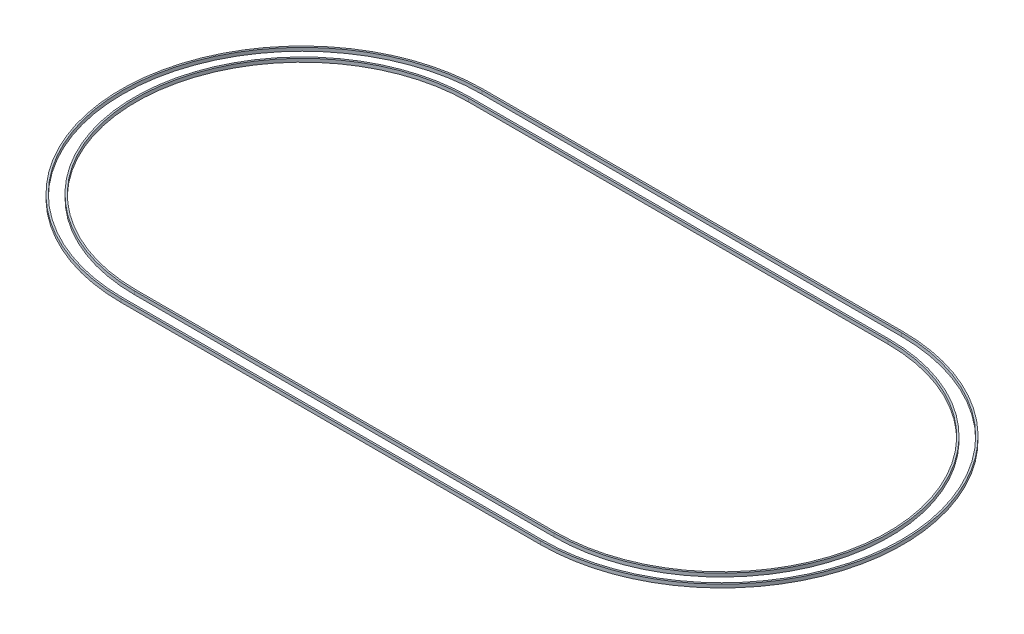
ISO-10303-21;
HEADER;
FILE_DESCRIPTION(('STEP AP214'),'2;1');
FILE_NAME('part.step','',(''),(''),'','','');
FILE_SCHEMA(('AUTOMOTIVE_DESIGN { 1 0 10303 214 1 1 1 1 }'));
ENDSEC;
DATA;
#1=APPLICATION_CONTEXT('core data for automotive mechanical design processes');
#2=APPLICATION_PROTOCOL_DEFINITION('international standard','automotive_design',2000,#1);
#3=PRODUCT_CONTEXT('',#1,'mechanical');
#4=PRODUCT('Part','Part','',(#3));
#5=PRODUCT_RELATED_PRODUCT_CATEGORY('part','',(#4));
#6=PRODUCT_DEFINITION_FORMATION('','',#4);
#7=PRODUCT_DEFINITION_CONTEXT('part definition',#1,'design');
#8=PRODUCT_DEFINITION('design','',#6,#7);
#9=PRODUCT_DEFINITION_SHAPE('','',#8);
#10=(LENGTH_UNIT() NAMED_UNIT(*) SI_UNIT(.MILLI.,.METRE.));
#11=(NAMED_UNIT(*) PLANE_ANGLE_UNIT() SI_UNIT($,.RADIAN.));
#12=(NAMED_UNIT(*) SI_UNIT($,.STERADIAN.) SOLID_ANGLE_UNIT());
#13=UNCERTAINTY_MEASURE_WITH_UNIT(LENGTH_MEASURE(1.E-05),#10,'distance_accuracy_value','');
#14=(GEOMETRIC_REPRESENTATION_CONTEXT(3) GLOBAL_UNCERTAINTY_ASSIGNED_CONTEXT((#13)) GLOBAL_UNIT_ASSIGNED_CONTEXT((#10,
#11,#12)) REPRESENTATION_CONTEXT('',''));
#15=CARTESIAN_POINT('',(0.,0.,0.));
#16=DIRECTION('',(0.,0.,1.));
#17=DIRECTION('',(1.,0.,0.));
#18=AXIS2_PLACEMENT_3D('',#15,#16,#17);
#19=CARTESIAN_POINT('',(-25000.,400.,-21600.));
#20=DIRECTION('',(0.,0.,-1.));
#21=DIRECTION('',(-1.,0.,0.));
#22=AXIS2_PLACEMENT_3D('',#19,#20,#21);
#23=PLANE('',#22);
#24=DIRECTION('',(1.,0.,0.));
#25=VECTOR('',#24,1.);
#26=CARTESIAN_POINT('',(-25000.,0.,-21600.));
#27=LINE('',#26,#25);
#28=CARTESIAN_POINT('',(-25000.,0.,-21600.));
#29=VERTEX_POINT('',#28);
#30=CARTESIAN_POINT('',(25000.,0.,-21600.));
#31=VERTEX_POINT('',#30);
#32=EDGE_CURVE('E162',#29,#31,#27,.T.);
#33=ORIENTED_EDGE('',*,*,#32,.F.);
#34=DIRECTION('',(0.,-1.,0.));
#35=VECTOR('',#34,1.);
#36=CARTESIAN_POINT('',(-25000.,400.,-21600.));
#37=LINE('',#36,#35);
#38=CARTESIAN_POINT('',(-25000.,400.,-21600.));
#39=VERTEX_POINT('',#38);
#40=EDGE_CURVE('E13',#39,#29,#37,.T.);
#41=ORIENTED_EDGE('',*,*,#40,.F.);
#42=DIRECTION('',(1.,0.,0.));
#43=VECTOR('',#42,1.);
#44=CARTESIAN_POINT('',(-25000.,400.,-21600.));
#45=LINE('',#44,#43);
#46=CARTESIAN_POINT('',(25000.,400.,-21600.));
#47=VERTEX_POINT('',#46);
#48=EDGE_CURVE('E166',#39,#47,#45,.T.);
#49=ORIENTED_EDGE('',*,*,#48,.T.);
#50=DIRECTION('',(0.,-1.,0.));
#51=VECTOR('',#50,1.);
#52=CARTESIAN_POINT('',(25000.,400.,-21600.));
#53=LINE('',#52,#51);
#54=EDGE_CURVE('E69',#47,#31,#53,.T.);
#55=ORIENTED_EDGE('',*,*,#54,.T.);
#56=EDGE_LOOP('',(#33,#41,#49,#55));
#57=FACE_BOUND('',#56,.T.);
#58=ADVANCED_FACE('F66',(#57),#23,.T.);
#59=CARTESIAN_POINT('',(-25000.,400.,9.18485099360515E-12));
#60=DIRECTION('',(0.,-1.,0.));
#61=DIRECTION('',(0.,0.,-1.));
#62=AXIS2_PLACEMENT_3D('',#59,#60,#61);
#63=CYLINDRICAL_SURFACE('',#62,21600.);
#64=CARTESIAN_POINT('',(-25000.,0.,9.18485099360515E-12));
#65=DIRECTION('',(0.,1.,0.));
#66=DIRECTION('',(0.,0.,1.));
#67=AXIS2_PLACEMENT_3D('',#64,#65,#66);
#68=CIRCLE('',#67,21600.);
#69=CARTESIAN_POINT('',(-25000.,0.,21600.));
#70=VERTEX_POINT('',#69);
#71=EDGE_CURVE('E170',#29,#70,#68,.T.);
#72=ORIENTED_EDGE('',*,*,#71,.T.);
#73=DIRECTION('',(0.,-1.,0.));
#74=VECTOR('',#73,1.);
#75=CARTESIAN_POINT('',(-25000.,400.,21600.));
#76=LINE('',#75,#74);
#77=CARTESIAN_POINT('',(-25000.,400.,21600.));
#78=VERTEX_POINT('',#77);
#79=EDGE_CURVE('E74',#78,#70,#76,.T.);
#80=ORIENTED_EDGE('',*,*,#79,.F.);
#81=CARTESIAN_POINT('',(-25000.,400.,9.18485099360515E-12));
#82=DIRECTION('',(0.,1.,0.));
#83=DIRECTION('',(0.,0.,1.));
#84=AXIS2_PLACEMENT_3D('',#81,#82,#83);
#85=CIRCLE('',#84,21600.);
#86=EDGE_CURVE('E175',#39,#78,#85,.T.);
#87=ORIENTED_EDGE('',*,*,#86,.F.);
#88=ORIENTED_EDGE('',*,*,#40,.T.);
#89=EDGE_LOOP('',(#72,#80,#87,#88));
#90=FACE_BOUND('',#89,.T.);
#91=ADVANCED_FACE('F202',(#90),#63,.T.);
#92=CARTESIAN_POINT('',(-25000.,400.,21600.));
#93=DIRECTION('',(0.,0.,-1.));
#94=DIRECTION('',(-1.,0.,0.));
#95=AXIS2_PLACEMENT_3D('',#92,#93,#94);
#96=PLANE('',#95);
#97=DIRECTION('',(1.,0.,0.));
#98=VECTOR('',#97,1.);
#99=CARTESIAN_POINT('',(-25000.,0.,21600.));
#100=LINE('',#99,#98);
#101=CARTESIAN_POINT('',(25000.,0.,21600.));
#102=VERTEX_POINT('',#101);
#103=EDGE_CURVE('E182',#70,#102,#100,.T.);
#104=ORIENTED_EDGE('',*,*,#103,.T.);
#105=DIRECTION('',(0.,-1.,0.));
#106=VECTOR('',#105,1.);
#107=CARTESIAN_POINT('',(25000.,400.,21600.));
#108=LINE('',#107,#106);
#109=CARTESIAN_POINT('',(25000.,400.,21600.));
#110=VERTEX_POINT('',#109);
#111=EDGE_CURVE('E187',#110,#102,#108,.T.);
#112=ORIENTED_EDGE('',*,*,#111,.F.);
#113=DIRECTION('',(1.,0.,0.));
#114=VECTOR('',#113,1.);
#115=CARTESIAN_POINT('',(-25000.,400.,21600.));
#116=LINE('',#115,#114);
#117=EDGE_CURVE('E173',#78,#110,#116,.T.);
#118=ORIENTED_EDGE('',*,*,#117,.F.);
#119=ORIENTED_EDGE('',*,*,#79,.T.);
#120=EDGE_LOOP('',(#104,#112,#118,#119));
#121=FACE_BOUND('',#120,.T.);
#122=ADVANCED_FACE('F206',(#121),#96,.F.);
#123=CARTESIAN_POINT('',(25000.,400.,0.));
#124=DIRECTION('',(0.,-1.,0.));
#125=DIRECTION('',(0.,0.,-1.));
#126=AXIS2_PLACEMENT_3D('',#123,#124,#125);
#127=CYLINDRICAL_SURFACE('',#126,21600.);
#128=CARTESIAN_POINT('',(25000.,0.,0.));
#129=DIRECTION('',(0.,-1.,0.));
#130=DIRECTION('',(0.,0.,-1.));
#131=AXIS2_PLACEMENT_3D('',#128,#129,#130);
#132=CIRCLE('',#131,21600.);
#133=EDGE_CURVE('E179',#31,#102,#132,.T.);
#134=ORIENTED_EDGE('',*,*,#133,.F.);
#135=ORIENTED_EDGE('',*,*,#54,.F.);
#136=CARTESIAN_POINT('',(25000.,400.,0.));
#137=DIRECTION('',(0.,-1.,0.));
#138=DIRECTION('',(0.,0.,-1.));
#139=AXIS2_PLACEMENT_3D('',#136,#137,#138);
#140=CIRCLE('',#139,21600.);
#141=EDGE_CURVE('E169',#47,#110,#140,.T.);
#142=ORIENTED_EDGE('',*,*,#141,.T.);
#143=ORIENTED_EDGE('',*,*,#111,.T.);
#144=EDGE_LOOP('',(#134,#135,#142,#143));
#145=FACE_BOUND('',#144,.T.);
#146=ADVANCED_FACE('F195',(#145),#127,.T.);
#147=CARTESIAN_POINT('',(25000.,400.,0.));
#148=DIRECTION('',(0.,-1.,0.));
#149=DIRECTION('',(0.,0.,-1.));
#150=AXIS2_PLACEMENT_3D('',#147,#148,#149);
#151=PLANE('',#150);
#152=CARTESIAN_POINT('',(-25000.,400.,9.84811851154435E-12));
#153=DIRECTION('',(0.,1.,0.));
#154=DIRECTION('',(0.,0.,1.));
#155=AXIS2_PLACEMENT_3D('',#152,#153,#154);
#156=CIRCLE('',#155,21400.);
#157=CARTESIAN_POINT('',(-25000.,400.,-21400.));
#158=VERTEX_POINT('',#157);
#159=CARTESIAN_POINT('',(-25000.,400.,21400.));
#160=VERTEX_POINT('',#159);
#161=EDGE_CURVE('E136',#158,#160,#156,.T.);
#162=ORIENTED_EDGE('',*,*,#161,.F.);
#163=DIRECTION('',(1.,0.,0.));
#164=VECTOR('',#163,1.);
#165=CARTESIAN_POINT('',(-25000.,400.,-21400.));
#166=LINE('',#165,#164);
#167=CARTESIAN_POINT('',(25000.,400.,-21400.));
#168=VERTEX_POINT('',#167);
#169=EDGE_CURVE('E133',#158,#168,#166,.T.);
#170=ORIENTED_EDGE('',*,*,#169,.T.);
#171=CARTESIAN_POINT('',(25000.,400.,6.63267517939197E-13));
#172=DIRECTION('',(0.,-1.,0.));
#173=DIRECTION('',(0.,0.,-1.));
#174=AXIS2_PLACEMENT_3D('',#171,#172,#173);
#175=CIRCLE('',#174,21400.);
#176=CARTESIAN_POINT('',(25000.,400.,21400.));
#177=VERTEX_POINT('',#176);
#178=EDGE_CURVE('E139',#168,#177,#175,.T.);
#179=ORIENTED_EDGE('',*,*,#178,.T.);
#180=DIRECTION('',(1.,0.,0.));
#181=VECTOR('',#180,1.);
#182=CARTESIAN_POINT('',(-25000.,400.,21400.));
#183=LINE('',#182,#181);
#184=EDGE_CURVE('E143',#160,#177,#183,.T.);
#185=ORIENTED_EDGE('',*,*,#184,.F.);
#186=EDGE_LOOP('',(#162,#170,#179,#185));
#187=FACE_BOUND('',#186,.T.);
#188=ORIENTED_EDGE('',*,*,#48,.F.);
#189=ORIENTED_EDGE('',*,*,#86,.T.);
#190=ORIENTED_EDGE('',*,*,#117,.T.);
#191=ORIENTED_EDGE('',*,*,#141,.F.);
#192=EDGE_LOOP('',(#188,#189,#190,#191));
#193=FACE_BOUND('',#192,.T.);
#194=ADVANCED_FACE('F145',(#187,#193),#151,.F.);
#195=CARTESIAN_POINT('',(25000.,0.,0.));
#196=DIRECTION('',(0.,-1.,0.));
#197=DIRECTION('',(0.,0.,-1.));
#198=AXIS2_PLACEMENT_3D('',#195,#196,#197);
#199=PLANE('',#198);
#200=DIRECTION('',(1.,0.,0.));
#201=VECTOR('',#200,1.);
#202=CARTESIAN_POINT('',(-25000.,0.,-21400.));
#203=LINE('',#202,#201);
#204=CARTESIAN_POINT('',(-25000.,0.,-21400.));
#205=VERTEX_POINT('',#204);
#206=CARTESIAN_POINT('',(25000.,0.,-21400.));
#207=VERTEX_POINT('',#206);
#208=EDGE_CURVE('E90',#205,#207,#203,.T.);
#209=ORIENTED_EDGE('',*,*,#208,.F.);
#210=CARTESIAN_POINT('',(-25000.,0.,9.84811851154435E-12));
#211=DIRECTION('',(0.,1.,0.));
#212=DIRECTION('',(0.,0.,1.));
#213=AXIS2_PLACEMENT_3D('',#210,#211,#212);
#214=CIRCLE('',#213,21400.);
#215=CARTESIAN_POINT('',(-25000.,0.,21400.));
#216=VERTEX_POINT('',#215);
#217=EDGE_CURVE('E147',#205,#216,#214,.T.);
#218=ORIENTED_EDGE('',*,*,#217,.T.);
#219=DIRECTION('',(1.,0.,0.));
#220=VECTOR('',#219,1.);
#221=CARTESIAN_POINT('',(-25000.,0.,21400.));
#222=LINE('',#221,#220);
#223=CARTESIAN_POINT('',(25000.,0.,21400.));
#224=VERTEX_POINT('',#223);
#225=EDGE_CURVE('E150',#216,#224,#222,.T.);
#226=ORIENTED_EDGE('',*,*,#225,.T.);
#227=CARTESIAN_POINT('',(25000.,0.,6.63267517939197E-13));
#228=DIRECTION('',(0.,-1.,0.));
#229=DIRECTION('',(0.,0.,-1.));
#230=AXIS2_PLACEMENT_3D('',#227,#228,#229);
#231=CIRCLE('',#230,21400.);
#232=EDGE_CURVE('E156',#207,#224,#231,.T.);
#233=ORIENTED_EDGE('',*,*,#232,.F.);
#234=EDGE_LOOP('',(#209,#218,#226,#233));
#235=FACE_BOUND('',#234,.T.);
#236=ORIENTED_EDGE('',*,*,#32,.T.);
#237=ORIENTED_EDGE('',*,*,#133,.T.);
#238=ORIENTED_EDGE('',*,*,#103,.F.);
#239=ORIENTED_EDGE('',*,*,#71,.F.);
#240=EDGE_LOOP('',(#236,#237,#238,#239));
#241=FACE_BOUND('',#240,.T.);
#242=ADVANCED_FACE('F199',(#235,#241),#199,.T.);
#243=CARTESIAN_POINT('',(-25000.,400.,-21400.));
#244=DIRECTION('',(0.,0.,-1.));
#245=DIRECTION('',(-1.,0.,0.));
#246=AXIS2_PLACEMENT_3D('',#243,#244,#245);
#247=PLANE('',#246);
#248=ORIENTED_EDGE('',*,*,#208,.T.);
#249=DIRECTION('',(0.,-1.,0.));
#250=VECTOR('',#249,1.);
#251=CARTESIAN_POINT('',(25000.,400.,-21400.));
#252=LINE('',#251,#250);
#253=EDGE_CURVE('E130',#168,#207,#252,.T.);
#254=ORIENTED_EDGE('',*,*,#253,.F.);
#255=ORIENTED_EDGE('',*,*,#169,.F.);
#256=DIRECTION('',(0.,-1.,0.));
#257=VECTOR('',#256,1.);
#258=CARTESIAN_POINT('',(-25000.,400.,-21400.));
#259=LINE('',#258,#257);
#260=EDGE_CURVE('E160',#158,#205,#259,.T.);
#261=ORIENTED_EDGE('',*,*,#260,.T.);
#262=EDGE_LOOP('',(#248,#254,#255,#261));
#263=FACE_BOUND('',#262,.T.);
#264=ADVANCED_FACE('F131',(#263),#247,.F.);
#265=CARTESIAN_POINT('',(-25000.,400.,9.84811851154435E-12));
#266=DIRECTION('',(0.,-1.,0.));
#267=DIRECTION('',(0.,0.,-1.));
#268=AXIS2_PLACEMENT_3D('',#265,#266,#267);
#269=CYLINDRICAL_SURFACE('',#268,21400.);
#270=ORIENTED_EDGE('',*,*,#217,.F.);
#271=ORIENTED_EDGE('',*,*,#260,.F.);
#272=ORIENTED_EDGE('',*,*,#161,.T.);
#273=DIRECTION('',(0.,-1.,0.));
#274=VECTOR('',#273,1.);
#275=CARTESIAN_POINT('',(-25000.,400.,21400.));
#276=LINE('',#275,#274);
#277=EDGE_CURVE('E163',#160,#216,#276,.T.);
#278=ORIENTED_EDGE('',*,*,#277,.T.);
#279=EDGE_LOOP('',(#270,#271,#272,#278));
#280=FACE_BOUND('',#279,.T.);
#281=ADVANCED_FACE('F250',(#280),#269,.F.);
#282=CARTESIAN_POINT('',(-25000.,400.,21400.));
#283=DIRECTION('',(0.,0.,-1.));
#284=DIRECTION('',(-1.,0.,0.));
#285=AXIS2_PLACEMENT_3D('',#282,#283,#284);
#286=PLANE('',#285);
#287=ORIENTED_EDGE('',*,*,#225,.F.);
#288=ORIENTED_EDGE('',*,*,#277,.F.);
#289=ORIENTED_EDGE('',*,*,#184,.T.);
#290=DIRECTION('',(0.,-1.,0.));
#291=VECTOR('',#290,1.);
#292=CARTESIAN_POINT('',(25000.,400.,21400.));
#293=LINE('',#292,#291);
#294=EDGE_CURVE('E82',#177,#224,#293,.T.);
#295=ORIENTED_EDGE('',*,*,#294,.T.);
#296=EDGE_LOOP('',(#287,#288,#289,#295));
#297=FACE_BOUND('',#296,.T.);
#298=ADVANCED_FACE('F258',(#297),#286,.T.);
#299=CARTESIAN_POINT('',(25000.,400.,6.63267517939197E-13));
#300=DIRECTION('',(0.,-1.,0.));
#301=DIRECTION('',(0.,0.,-1.));
#302=AXIS2_PLACEMENT_3D('',#299,#300,#301);
#303=CYLINDRICAL_SURFACE('',#302,21400.);
#304=ORIENTED_EDGE('',*,*,#232,.T.);
#305=ORIENTED_EDGE('',*,*,#294,.F.);
#306=ORIENTED_EDGE('',*,*,#178,.F.);
#307=ORIENTED_EDGE('',*,*,#253,.T.);
#308=EDGE_LOOP('',(#304,#305,#306,#307));
#309=FACE_BOUND('',#308,.T.);
#310=ADVANCED_FACE('F140',(#309),#303,.F.);
#311=CLOSED_SHELL('',(#58,#91,#122,#146,#194,#242,#264,#281,#298,#310));
#312=MANIFOLD_SOLID_BREP('B2',#311);
#313=CARTESIAN_POINT('',(25000.,400.,6.63267517939197E-13));
#314=DIRECTION('',(0.,-1.,0.));
#315=DIRECTION('',(0.,0.,-1.));
#316=AXIS2_PLACEMENT_3D('',#313,#314,#315);
#317=CYLINDRICAL_SURFACE('',#316,20000.);
#318=CARTESIAN_POINT('',(25000.,0.,6.63267517939197E-13));
#319=DIRECTION('',(0.,1.,0.));
#320=DIRECTION('',(0.,0.,1.));
#321=AXIS2_PLACEMENT_3D('',#318,#319,#320);
#322=CIRCLE('',#321,20000.);
#323=CARTESIAN_POINT('',(25000.,0.,-20000.));
#324=VERTEX_POINT('',#323);
#325=CARTESIAN_POINT('',(25000.,0.,20000.));
#326=VERTEX_POINT('',#325);
#327=EDGE_CURVE('E406',#324,#326,#322,.F.);
#328=ORIENTED_EDGE('',*,*,#327,.F.);
#329=DIRECTION('',(0.,-1.,0.));
#330=VECTOR('',#329,1.);
#331=CARTESIAN_POINT('',(25000.,400.,-20000.));
#332=LINE('',#331,#330);
#333=CARTESIAN_POINT('',(25000.,400.,-20000.));
#334=VERTEX_POINT('',#333);
#335=EDGE_CURVE('E64',#334,#324,#332,.T.);
#336=ORIENTED_EDGE('',*,*,#335,.F.);
#337=CARTESIAN_POINT('',(25000.,400.,6.63267517939197E-13));
#338=DIRECTION('',(0.,1.,0.));
#339=DIRECTION('',(0.,0.,1.));
#340=AXIS2_PLACEMENT_3D('',#337,#338,#339);
#341=CIRCLE('',#340,20000.);
#342=CARTESIAN_POINT('',(25000.,400.,20000.));
#343=VERTEX_POINT('',#342);
#344=EDGE_CURVE('E387',#334,#343,#341,.F.);
#345=ORIENTED_EDGE('',*,*,#344,.T.);
#346=DIRECTION('',(0.,-1.,0.));
#347=VECTOR('',#346,1.);
#348=CARTESIAN_POINT('',(25000.,400.,20000.));
#349=LINE('',#348,#347);
#350=EDGE_CURVE('E349',#343,#326,#349,.T.);
#351=ORIENTED_EDGE('',*,*,#350,.T.);
#352=EDGE_LOOP('',(#328,#336,#345,#351));
#353=FACE_BOUND('',#352,.T.);
#354=ADVANCED_FACE('F295',(#353),#317,.T.);
#355=CARTESIAN_POINT('',(0.,400.,-20000.));
#356=DIRECTION('',(0.,0.,-1.));
#357=DIRECTION('',(-1.,0.,0.));
#358=AXIS2_PLACEMENT_3D('',#355,#356,#357);
#359=PLANE('',#358);
#360=DIRECTION('',(1.,0.,0.));
#361=VECTOR('',#360,1.);
#362=CARTESIAN_POINT('',(0.,0.,-20000.));
#363=LINE('',#362,#361);
#364=CARTESIAN_POINT('',(-25000.,0.,-20000.));
#365=VERTEX_POINT('',#364);
#366=EDGE_CURVE('E377',#365,#324,#363,.T.);
#367=ORIENTED_EDGE('',*,*,#366,.F.);
#368=DIRECTION('',(0.,-1.,0.));
#369=VECTOR('',#368,1.);
#370=CARTESIAN_POINT('',(-25000.,400.,-20000.));
#371=LINE('',#370,#369);
#372=CARTESIAN_POINT('',(-25000.,400.,-20000.));
#373=VERTEX_POINT('',#372);
#374=EDGE_CURVE('E305',#373,#365,#371,.T.);
#375=ORIENTED_EDGE('',*,*,#374,.F.);
#376=DIRECTION('',(1.,0.,0.));
#377=VECTOR('',#376,1.);
#378=CARTESIAN_POINT('',(0.,400.,-20000.));
#379=LINE('',#378,#377);
#380=EDGE_CURVE('E375',#373,#334,#379,.T.);
#381=ORIENTED_EDGE('',*,*,#380,.T.);
#382=ORIENTED_EDGE('',*,*,#335,.T.);
#383=EDGE_LOOP('',(#367,#375,#381,#382));
#384=FACE_BOUND('',#383,.T.);
#385=ADVANCED_FACE('F373',(#384),#359,.T.);
#386=CARTESIAN_POINT('',(-25000.,400.,9.84811851154435E-12));
#387=DIRECTION('',(0.,-1.,0.));
#388=DIRECTION('',(0.,0.,-1.));
#389=AXIS2_PLACEMENT_3D('',#386,#387,#388);
#390=CYLINDRICAL_SURFACE('',#389,20000.);
#391=CARTESIAN_POINT('',(-25000.,0.,9.84811851154435E-12));
#392=DIRECTION('',(0.,1.,0.));
#393=DIRECTION('',(0.,0.,1.));
#394=AXIS2_PLACEMENT_3D('',#391,#392,#393);
#395=CIRCLE('',#394,20000.);
#396=CARTESIAN_POINT('',(-25000.,0.,20000.));
#397=VERTEX_POINT('',#396);
#398=EDGE_CURVE('E409',#365,#397,#395,.T.);
#399=ORIENTED_EDGE('',*,*,#398,.T.);
#400=DIRECTION('',(0.,-1.,0.));
#401=VECTOR('',#400,1.);
#402=CARTESIAN_POINT('',(-25000.,400.,20000.));
#403=LINE('',#402,#401);
#404=CARTESIAN_POINT('',(-25000.,400.,20000.));
#405=VERTEX_POINT('',#404);
#406=EDGE_CURVE('E380',#405,#397,#403,.T.);
#407=ORIENTED_EDGE('',*,*,#406,.F.);
#408=CARTESIAN_POINT('',(-25000.,400.,9.84811851154435E-12));
#409=DIRECTION('',(0.,1.,0.));
#410=DIRECTION('',(0.,0.,1.));
#411=AXIS2_PLACEMENT_3D('',#408,#409,#410);
#412=CIRCLE('',#411,20000.);
#413=EDGE_CURVE('E383',#373,#405,#412,.T.);
#414=ORIENTED_EDGE('',*,*,#413,.F.);
#415=ORIENTED_EDGE('',*,*,#374,.T.);
#416=EDGE_LOOP('',(#399,#407,#414,#415));
#417=FACE_BOUND('',#416,.T.);
#418=ADVANCED_FACE('F384',(#417),#390,.T.);
#419=CARTESIAN_POINT('',(-25000.,400.,9.84811851154435E-12));
#420=DIRECTION('',(0.,-1.,0.));
#421=DIRECTION('',(0.,0.,-1.));
#422=AXIS2_PLACEMENT_3D('',#419,#420,#421);
#423=CYLINDRICAL_SURFACE('',#422,19800.);
#424=CARTESIAN_POINT('',(-25000.,0.,9.84811851154435E-12));
#425=DIRECTION('',(0.,1.,0.));
#426=DIRECTION('',(0.,0.,1.));
#427=AXIS2_PLACEMENT_3D('',#424,#425,#426);
#428=CIRCLE('',#427,19800.);
#429=CARTESIAN_POINT('',(-25000.,0.,-19800.));
#430=VERTEX_POINT('',#429);
#431=CARTESIAN_POINT('',(-25000.,0.,19800.));
#432=VERTEX_POINT('',#431);
#433=EDGE_CURVE('E395',#430,#432,#428,.T.);
#434=ORIENTED_EDGE('',*,*,#433,.F.);
#435=DIRECTION('',(0.,-1.,0.));
#436=VECTOR('',#435,1.);
#437=CARTESIAN_POINT('',(-25000.,400.,-19800.));
#438=LINE('',#437,#436);
#439=CARTESIAN_POINT('',(-25000.,400.,-19800.));
#440=VERTEX_POINT('',#439);
#441=EDGE_CURVE('E299',#440,#430,#438,.T.);
#442=ORIENTED_EDGE('',*,*,#441,.F.);
#443=CARTESIAN_POINT('',(-25000.,400.,9.84811851154435E-12));
#444=DIRECTION('',(0.,1.,0.));
#445=DIRECTION('',(0.,0.,1.));
#446=AXIS2_PLACEMENT_3D('',#443,#444,#445);
#447=CIRCLE('',#446,19800.);
#448=CARTESIAN_POINT('',(-25000.,400.,19800.));
#449=VERTEX_POINT('',#448);
#450=EDGE_CURVE('E412',#440,#449,#447,.T.);
#451=ORIENTED_EDGE('',*,*,#450,.T.);
#452=DIRECTION('',(0.,-1.,0.));
#453=VECTOR('',#452,1.);
#454=CARTESIAN_POINT('',(-25000.,400.,19800.));
#455=LINE('',#454,#453);
#456=EDGE_CURVE('E394',#449,#432,#455,.T.);
#457=ORIENTED_EDGE('',*,*,#456,.T.);
#458=EDGE_LOOP('',(#434,#442,#451,#457));
#459=FACE_BOUND('',#458,.T.);
#460=ADVANCED_FACE('F297',(#459),#423,.F.);
#461=CARTESIAN_POINT('',(0.,400.,-19800.));
#462=DIRECTION('',(0.,0.,-1.));
#463=DIRECTION('',(-1.,0.,0.));
#464=AXIS2_PLACEMENT_3D('',#461,#462,#463);
#465=PLANE('',#464);
#466=DIRECTION('',(1.,0.,0.));
#467=VECTOR('',#466,1.);
#468=CARTESIAN_POINT('',(0.,0.,-19800.));
#469=LINE('',#468,#467);
#470=CARTESIAN_POINT('',(25000.,0.,-19800.));
#471=VERTEX_POINT('',#470);
#472=EDGE_CURVE('E398',#430,#471,#469,.T.);
#473=ORIENTED_EDGE('',*,*,#472,.T.);
#474=DIRECTION('',(0.,-1.,0.));
#475=VECTOR('',#474,1.);
#476=CARTESIAN_POINT('',(25000.,400.,-19800.));
#477=LINE('',#476,#475);
#478=CARTESIAN_POINT('',(25000.,400.,-19800.));
#479=VERTEX_POINT('',#478);
#480=EDGE_CURVE('E417',#479,#471,#477,.T.);
#481=ORIENTED_EDGE('',*,*,#480,.F.);
#482=DIRECTION('',(1.,0.,0.));
#483=VECTOR('',#482,1.);
#484=CARTESIAN_POINT('',(0.,400.,-19800.));
#485=LINE('',#484,#483);
#486=EDGE_CURVE('E426',#440,#479,#485,.T.);
#487=ORIENTED_EDGE('',*,*,#486,.F.);
#488=ORIENTED_EDGE('',*,*,#441,.T.);
#489=EDGE_LOOP('',(#473,#481,#487,#488));
#490=FACE_BOUND('',#489,.T.);
#491=ADVANCED_FACE('F425',(#490),#465,.F.);
#492=CARTESIAN_POINT('',(25000.,400.,6.63267517939197E-13));
#493=DIRECTION('',(0.,-1.,0.));
#494=DIRECTION('',(0.,0.,-1.));
#495=AXIS2_PLACEMENT_3D('',#492,#493,#494);
#496=CYLINDRICAL_SURFACE('',#495,19800.);
#497=CARTESIAN_POINT('',(25000.,0.,6.63267517939197E-13));
#498=DIRECTION('',(0.,1.,0.));
#499=DIRECTION('',(0.,0.,1.));
#500=AXIS2_PLACEMENT_3D('',#497,#498,#499);
#501=CIRCLE('',#500,19800.);
#502=CARTESIAN_POINT('',(25000.,0.,19800.));
#503=VERTEX_POINT('',#502);
#504=EDGE_CURVE('E400',#471,#503,#501,.F.);
#505=ORIENTED_EDGE('',*,*,#504,.T.);
#506=DIRECTION('',(0.,-1.,0.));
#507=VECTOR('',#506,1.);
#508=CARTESIAN_POINT('',(25000.,400.,19800.));
#509=LINE('',#508,#507);
#510=CARTESIAN_POINT('',(25000.,400.,19800.));
#511=VERTEX_POINT('',#510);
#512=EDGE_CURVE('E416',#511,#503,#509,.T.);
#513=ORIENTED_EDGE('',*,*,#512,.F.);
#514=CARTESIAN_POINT('',(25000.,400.,6.63267517939197E-13));
#515=DIRECTION('',(0.,1.,0.));
#516=DIRECTION('',(0.,0.,1.));
#517=AXIS2_PLACEMENT_3D('',#514,#515,#516);
#518=CIRCLE('',#517,19800.);
#519=EDGE_CURVE('E464',#479,#511,#518,.F.);
#520=ORIENTED_EDGE('',*,*,#519,.F.);
#521=ORIENTED_EDGE('',*,*,#480,.T.);
#522=EDGE_LOOP('',(#505,#513,#520,#521));
#523=FACE_BOUND('',#522,.T.);
#524=ADVANCED_FACE('F436',(#523),#496,.F.);
#525=CARTESIAN_POINT('',(0.,400.,19800.));
#526=DIRECTION('',(0.,0.,-1.));
#527=DIRECTION('',(-1.,0.,0.));
#528=AXIS2_PLACEMENT_3D('',#525,#526,#527);
#529=PLANE('',#528);
#530=DIRECTION('',(1.,0.,0.));
#531=VECTOR('',#530,1.);
#532=CARTESIAN_POINT('',(0.,0.,19800.));
#533=LINE('',#532,#531);
#534=EDGE_CURVE('E403',#432,#503,#533,.T.);
#535=ORIENTED_EDGE('',*,*,#534,.F.);
#536=ORIENTED_EDGE('',*,*,#456,.F.);
#537=DIRECTION('',(1.,0.,0.));
#538=VECTOR('',#537,1.);
#539=CARTESIAN_POINT('',(0.,400.,19800.));
#540=LINE('',#539,#538);
#541=EDGE_CURVE('E389',#449,#511,#540,.T.);
#542=ORIENTED_EDGE('',*,*,#541,.T.);
#543=ORIENTED_EDGE('',*,*,#512,.T.);
#544=EDGE_LOOP('',(#535,#536,#542,#543));
#545=FACE_BOUND('',#544,.T.);
#546=ADVANCED_FACE('F434',(#545),#529,.T.);
#547=CARTESIAN_POINT('',(0.,400.,20000.));
#548=DIRECTION('',(0.,0.,-1.));
#549=DIRECTION('',(-1.,0.,0.));
#550=AXIS2_PLACEMENT_3D('',#547,#548,#549);
#551=PLANE('',#550);
#552=DIRECTION('',(1.,0.,0.));
#553=VECTOR('',#552,1.);
#554=CARTESIAN_POINT('',(0.,0.,20000.));
#555=LINE('',#554,#553);
#556=EDGE_CURVE('E342',#397,#326,#555,.T.);
#557=ORIENTED_EDGE('',*,*,#556,.T.);
#558=ORIENTED_EDGE('',*,*,#350,.F.);
#559=DIRECTION('',(1.,0.,0.));
#560=VECTOR('',#559,1.);
#561=CARTESIAN_POINT('',(0.,400.,20000.));
#562=LINE('',#561,#560);
#563=EDGE_CURVE('E314',#405,#343,#562,.T.);
#564=ORIENTED_EDGE('',*,*,#563,.F.);
#565=ORIENTED_EDGE('',*,*,#406,.T.);
#566=EDGE_LOOP('',(#557,#558,#564,#565));
#567=FACE_BOUND('',#566,.T.);
#568=ADVANCED_FACE('F443',(#567),#551,.F.);
#569=CARTESIAN_POINT('',(0.,400.,0.));
#570=DIRECTION('',(0.,1.,0.));
#571=DIRECTION('',(0.,0.,1.));
#572=AXIS2_PLACEMENT_3D('',#569,#570,#571);
#573=PLANE('',#572);
#574=ORIENTED_EDGE('',*,*,#450,.F.);
#575=ORIENTED_EDGE('',*,*,#486,.T.);
#576=ORIENTED_EDGE('',*,*,#519,.T.);
#577=ORIENTED_EDGE('',*,*,#541,.F.);
#578=EDGE_LOOP('',(#574,#575,#576,#577));
#579=FACE_BOUND('',#578,.T.);
#580=ORIENTED_EDGE('',*,*,#344,.F.);
#581=ORIENTED_EDGE('',*,*,#380,.F.);
#582=ORIENTED_EDGE('',*,*,#413,.T.);
#583=ORIENTED_EDGE('',*,*,#563,.T.);
#584=EDGE_LOOP('',(#580,#581,#582,#583));
#585=FACE_BOUND('',#584,.T.);
#586=ADVANCED_FACE('F386',(#579,#585),#573,.T.);
#587=CARTESIAN_POINT('',(0.,0.,0.));
#588=DIRECTION('',(0.,1.,0.));
#589=DIRECTION('',(0.,0.,1.));
#590=AXIS2_PLACEMENT_3D('',#587,#588,#589);
#591=PLANE('',#590);
#592=ORIENTED_EDGE('',*,*,#433,.T.);
#593=ORIENTED_EDGE('',*,*,#534,.T.);
#594=ORIENTED_EDGE('',*,*,#504,.F.);
#595=ORIENTED_EDGE('',*,*,#472,.F.);
#596=EDGE_LOOP('',(#592,#593,#594,#595));
#597=FACE_BOUND('',#596,.T.);
#598=ORIENTED_EDGE('',*,*,#327,.T.);
#599=ORIENTED_EDGE('',*,*,#556,.F.);
#600=ORIENTED_EDGE('',*,*,#398,.F.);
#601=ORIENTED_EDGE('',*,*,#366,.T.);
#602=EDGE_LOOP('',(#598,#599,#600,#601));
#603=FACE_BOUND('',#602,.T.);
#604=ADVANCED_FACE('F429',(#597,#603),#591,.F.);
#605=CLOSED_SHELL('',(#354,#385,#418,#460,#491,#524,#546,#568,#586,#604));
#606=MANIFOLD_SOLID_BREP('B7',#605);
#607=ADVANCED_BREP_SHAPE_REPRESENTATION('',(#18,#312,#606),#14);
#608=SHAPE_DEFINITION_REPRESENTATION(#9,#607);
ENDSEC;
END-ISO-10303-21;
